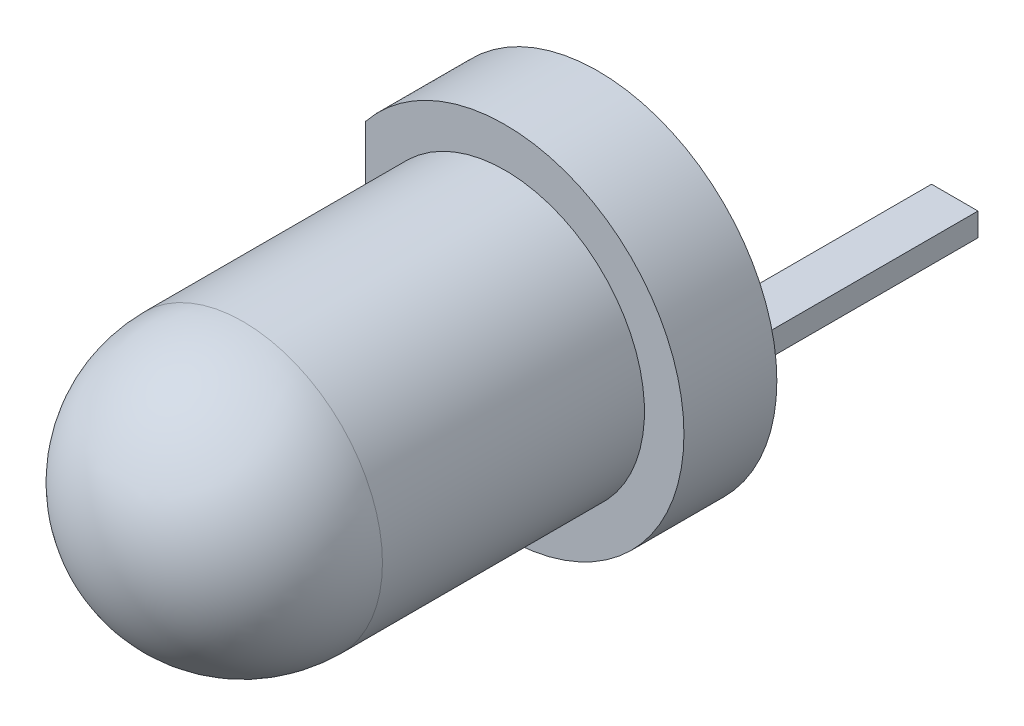
ISO-10303-21;
HEADER;
FILE_DESCRIPTION(('STEP AP214'),'2;1');
FILE_NAME('part.step','',(''),(''),'','','');
FILE_SCHEMA(('AUTOMOTIVE_DESIGN { 1 0 10303 214 1 1 1 1 }'));
ENDSEC;
DATA;
#1=APPLICATION_CONTEXT('core data for automotive mechanical design processes');
#2=APPLICATION_PROTOCOL_DEFINITION('international standard','automotive_design',2000,#1);
#3=PRODUCT_CONTEXT('',#1,'mechanical');
#4=PRODUCT('Part','Part','',(#3));
#5=PRODUCT_RELATED_PRODUCT_CATEGORY('part','',(#4));
#6=PRODUCT_DEFINITION_FORMATION('','',#4);
#7=PRODUCT_DEFINITION_CONTEXT('part definition',#1,'design');
#8=PRODUCT_DEFINITION('design','',#6,#7);
#9=PRODUCT_DEFINITION_SHAPE('','',#8);
#10=(LENGTH_UNIT() NAMED_UNIT(*) SI_UNIT(.MILLI.,.METRE.));
#11=(NAMED_UNIT(*) PLANE_ANGLE_UNIT() SI_UNIT($,.RADIAN.));
#12=(NAMED_UNIT(*) SI_UNIT($,.STERADIAN.) SOLID_ANGLE_UNIT());
#13=UNCERTAINTY_MEASURE_WITH_UNIT(LENGTH_MEASURE(1.E-05),#10,'distance_accuracy_value','');
#14=(GEOMETRIC_REPRESENTATION_CONTEXT(3) GLOBAL_UNCERTAINTY_ASSIGNED_CONTEXT((#13)) GLOBAL_UNIT_ASSIGNED_CONTEXT((#10,
#11,#12)) REPRESENTATION_CONTEXT('',''));
#15=CARTESIAN_POINT('',(0.,0.,0.));
#16=DIRECTION('',(0.,0.,1.));
#17=DIRECTION('',(1.,0.,0.));
#18=AXIS2_PLACEMENT_3D('',#15,#16,#17);
#19=CARTESIAN_POINT('',(-0.99,-0.125,-2.54));
#20=DIRECTION('',(-1.,0.,0.));
#21=DIRECTION('',(0.,0.,1.));
#22=AXIS2_PLACEMENT_3D('',#19,#20,#21);
#23=PLANE('',#22);
#24=DIRECTION('',(0.,-1.,0.));
#25=VECTOR('',#24,1.);
#26=CARTESIAN_POINT('',(-0.99,-0.125,-1.54));
#27=LINE('',#26,#25);
#28=CARTESIAN_POINT('',(-0.99,0.125,-1.54));
#29=VERTEX_POINT('',#28);
#30=CARTESIAN_POINT('',(-0.99,-0.125,-1.54));
#31=VERTEX_POINT('',#30);
#32=EDGE_CURVE('E121',#29,#31,#27,.T.);
#33=ORIENTED_EDGE('',*,*,#32,.F.);
#34=DIRECTION('',(0.,0.,1.));
#35=VECTOR('',#34,1.);
#36=CARTESIAN_POINT('',(-0.99,0.125,-2.54));
#37=LINE('',#36,#35);
#38=CARTESIAN_POINT('',(-0.99,0.125,0.));
#39=VERTEX_POINT('',#38);
#40=EDGE_CURVE('E129',#29,#39,#37,.T.);
#41=ORIENTED_EDGE('',*,*,#40,.T.);
#42=DIRECTION('',(0.,-1.,0.));
#43=VECTOR('',#42,1.);
#44=CARTESIAN_POINT('',(-0.99,-0.125,0.));
#45=LINE('',#44,#43);
#46=CARTESIAN_POINT('',(-0.99,-0.125,0.));
#47=VERTEX_POINT('',#46);
#48=EDGE_CURVE('E151',#39,#47,#45,.T.);
#49=ORIENTED_EDGE('',*,*,#48,.T.);
#50=DIRECTION('',(0.,0.,1.));
#51=VECTOR('',#50,1.);
#52=CARTESIAN_POINT('',(-0.99,-0.125,-2.54));
#53=LINE('',#52,#51);
#54=EDGE_CURVE('E131',#31,#47,#53,.T.);
#55=ORIENTED_EDGE('',*,*,#54,.F.);
#56=EDGE_LOOP('',(#33,#41,#49,#55));
#57=FACE_BOUND('',#56,.T.);
#58=ADVANCED_FACE('F43',(#57),#23,.F.);
#59=CARTESIAN_POINT('',(-1.49,-0.125,-2.54));
#60=DIRECTION('',(0.,1.,0.));
#61=DIRECTION('',(-1.,0.,0.));
#62=AXIS2_PLACEMENT_3D('',#59,#60,#61);
#63=PLANE('',#62);
#64=DIRECTION('',(-1.,0.,0.));
#65=VECTOR('',#64,1.);
#66=CARTESIAN_POINT('',(-1.49,-0.125,-1.54));
#67=LINE('',#66,#65);
#68=CARTESIAN_POINT('',(-1.49,-0.125,-1.54));
#69=VERTEX_POINT('',#68);
#70=EDGE_CURVE('E132',#31,#69,#67,.T.);
#71=ORIENTED_EDGE('',*,*,#70,.F.);
#72=ORIENTED_EDGE('',*,*,#54,.T.);
#73=DIRECTION('',(-1.,0.,0.));
#74=VECTOR('',#73,1.);
#75=CARTESIAN_POINT('',(-1.49,-0.125,0.));
#76=LINE('',#75,#74);
#77=CARTESIAN_POINT('',(-1.49,-0.125,0.));
#78=VERTEX_POINT('',#77);
#79=EDGE_CURVE('E148',#47,#78,#76,.T.);
#80=ORIENTED_EDGE('',*,*,#79,.T.);
#81=DIRECTION('',(0.,0.,1.));
#82=VECTOR('',#81,1.);
#83=CARTESIAN_POINT('',(-1.49,-0.125,-2.54));
#84=LINE('',#83,#82);
#85=EDGE_CURVE('E142',#69,#78,#84,.T.);
#86=ORIENTED_EDGE('',*,*,#85,.F.);
#87=EDGE_LOOP('',(#71,#72,#80,#86));
#88=FACE_BOUND('',#87,.T.);
#89=ADVANCED_FACE('F194',(#88),#63,.F.);
#90=CARTESIAN_POINT('',(-1.49,-0.125,-2.54));
#91=DIRECTION('',(1.,0.,0.));
#92=DIRECTION('',(0.,0.,-1.));
#93=AXIS2_PLACEMENT_3D('',#90,#91,#92);
#94=PLANE('',#93);
#95=DIRECTION('',(0.,1.,0.));
#96=VECTOR('',#95,1.);
#97=CARTESIAN_POINT('',(-1.49,-0.125,-1.54));
#98=LINE('',#97,#96);
#99=CARTESIAN_POINT('',(-1.49,0.125,-1.54));
#100=VERTEX_POINT('',#99);
#101=EDGE_CURVE('E57',#69,#100,#98,.T.);
#102=ORIENTED_EDGE('',*,*,#101,.F.);
#103=ORIENTED_EDGE('',*,*,#85,.T.);
#104=DIRECTION('',(0.,1.,0.));
#105=VECTOR('',#104,1.);
#106=CARTESIAN_POINT('',(-1.49,-0.125,0.));
#107=LINE('',#106,#105);
#108=CARTESIAN_POINT('',(-1.49,0.125,0.));
#109=VERTEX_POINT('',#108);
#110=EDGE_CURVE('E140',#78,#109,#107,.T.);
#111=ORIENTED_EDGE('',*,*,#110,.T.);
#112=DIRECTION('',(0.,0.,1.));
#113=VECTOR('',#112,1.);
#114=CARTESIAN_POINT('',(-1.49,0.125,-2.54));
#115=LINE('',#114,#113);
#116=EDGE_CURVE('E138',#100,#109,#115,.T.);
#117=ORIENTED_EDGE('',*,*,#116,.F.);
#118=EDGE_LOOP('',(#102,#103,#111,#117));
#119=FACE_BOUND('',#118,.T.);
#120=ADVANCED_FACE('F199',(#119),#94,.F.);
#121=CARTESIAN_POINT('',(-1.49,0.125,-2.54));
#122=DIRECTION('',(0.,-1.,0.));
#123=DIRECTION('',(1.,0.,0.));
#124=AXIS2_PLACEMENT_3D('',#121,#122,#123);
#125=PLANE('',#124);
#126=DIRECTION('',(1.,0.,0.));
#127=VECTOR('',#126,1.);
#128=CARTESIAN_POINT('',(-1.49,0.125,-1.54));
#129=LINE('',#128,#127);
#130=EDGE_CURVE('E11',#100,#29,#129,.T.);
#131=ORIENTED_EDGE('',*,*,#130,.F.);
#132=ORIENTED_EDGE('',*,*,#116,.T.);
#133=DIRECTION('',(1.,0.,0.));
#134=VECTOR('',#133,1.);
#135=CARTESIAN_POINT('',(-1.49,0.125,0.));
#136=LINE('',#135,#134);
#137=EDGE_CURVE('E137',#109,#39,#136,.T.);
#138=ORIENTED_EDGE('',*,*,#137,.T.);
#139=ORIENTED_EDGE('',*,*,#40,.F.);
#140=EDGE_LOOP('',(#131,#132,#138,#139));
#141=FACE_BOUND('',#140,.T.);
#142=ADVANCED_FACE('F135',(#141),#125,.F.);
#143=CARTESIAN_POINT('',(0.,0.,0.));
#144=DIRECTION('',(0.,0.,1.));
#145=DIRECTION('',(1.,0.,0.));
#146=AXIS2_PLACEMENT_3D('',#143,#144,#145);
#147=PLANE('',#146);
#148=ORIENTED_EDGE('',*,*,#48,.F.);
#149=ORIENTED_EDGE('',*,*,#137,.F.);
#150=ORIENTED_EDGE('',*,*,#110,.F.);
#151=ORIENTED_EDGE('',*,*,#79,.F.);
#152=EDGE_LOOP('',(#148,#149,#150,#151));
#153=FACE_BOUND('',#152,.T.);
#154=DIRECTION('',(0.,1.,0.));
#155=VECTOR('',#154,1.);
#156=CARTESIAN_POINT('',(-1.5,-1.20649285120137,0.));
#157=LINE('',#156,#155);
#158=CARTESIAN_POINT('',(-1.5,-1.20649285120137,0.));
#159=VERTEX_POINT('',#158);
#160=CARTESIAN_POINT('',(-1.5,1.20649285120137,0.));
#161=VERTEX_POINT('',#160);
#162=EDGE_CURVE('E158',#159,#161,#157,.T.);
#163=ORIENTED_EDGE('',*,*,#162,.T.);
#164=CARTESIAN_POINT('',(0.,0.,0.));
#165=DIRECTION('',(0.,0.,-1.));
#166=DIRECTION('',(-1.,0.,0.));
#167=AXIS2_PLACEMENT_3D('',#164,#165,#166);
#168=CIRCLE('',#167,1.925);
#169=EDGE_CURVE('E163',#161,#159,#168,.T.);
#170=ORIENTED_EDGE('',*,*,#169,.T.);
#171=EDGE_LOOP('',(#163,#170));
#172=FACE_BOUND('',#171,.T.);
#173=DIRECTION('',(0.,1.,0.));
#174=VECTOR('',#173,1.);
#175=CARTESIAN_POINT('',(1.05,0.125,0.));
#176=LINE('',#175,#174);
#177=CARTESIAN_POINT('',(1.05,-0.125,0.));
#178=VERTEX_POINT('',#177);
#179=CARTESIAN_POINT('',(1.05,0.125,0.));
#180=VERTEX_POINT('',#179);
#181=EDGE_CURVE('E153',#178,#180,#176,.T.);
#182=ORIENTED_EDGE('',*,*,#181,.F.);
#183=DIRECTION('',(-1.,0.,0.));
#184=VECTOR('',#183,1.);
#185=CARTESIAN_POINT('',(1.55,-0.125,0.));
#186=LINE('',#185,#184);
#187=CARTESIAN_POINT('',(1.55,-0.125,0.));
#188=VERTEX_POINT('',#187);
#189=EDGE_CURVE('E227',#188,#178,#186,.T.);
#190=ORIENTED_EDGE('',*,*,#189,.F.);
#191=DIRECTION('',(0.,-1.,0.));
#192=VECTOR('',#191,1.);
#193=CARTESIAN_POINT('',(1.55,0.125,0.));
#194=LINE('',#193,#192);
#195=CARTESIAN_POINT('',(1.55,0.125,0.));
#196=VERTEX_POINT('',#195);
#197=EDGE_CURVE('E243',#196,#188,#194,.T.);
#198=ORIENTED_EDGE('',*,*,#197,.F.);
#199=DIRECTION('',(1.,0.,0.));
#200=VECTOR('',#199,1.);
#201=CARTESIAN_POINT('',(1.55,0.125,0.));
#202=LINE('',#201,#200);
#203=EDGE_CURVE('E65',#180,#196,#202,.T.);
#204=ORIENTED_EDGE('',*,*,#203,.F.);
#205=EDGE_LOOP('',(#182,#190,#198,#204));
#206=FACE_BOUND('',#205,.T.);
#207=ADVANCED_FACE('F183',(#153,#172,#206),#147,.F.);
#208=CARTESIAN_POINT('',(0.,0.,5.32));
#209=DIRECTION('',(0.,0.,-1.));
#210=DIRECTION('',(-1.,0.,0.));
#211=AXIS2_PLACEMENT_3D('',#208,#209,#210);
#212=CYLINDRICAL_SURFACE('',#211,1.5);
#213=CARTESIAN_POINT('',(0.,0.,3.82));
#214=DIRECTION('',(0.,0.,-1.));
#215=DIRECTION('',(-1.,0.,0.));
#216=AXIS2_PLACEMENT_3D('',#213,#214,#215);
#217=CIRCLE('',#216,1.5);
#218=CARTESIAN_POINT('',(-1.5,0.,3.82));
#219=VERTEX_POINT('',#218);
#220=EDGE_CURVE('E171',#219,#219,#217,.T.);
#221=ORIENTED_EDGE('',*,*,#220,.T.);
#222=EDGE_LOOP('',(#221));
#223=FACE_BOUND('',#222,.T.);
#224=CARTESIAN_POINT('',(0.,0.,1.));
#225=DIRECTION('',(0.,0.,-1.));
#226=DIRECTION('',(-1.,0.,0.));
#227=AXIS2_PLACEMENT_3D('',#224,#225,#226);
#228=CIRCLE('',#227,1.5);
#229=CARTESIAN_POINT('',(-1.5,0.,1.));
#230=VERTEX_POINT('',#229);
#231=EDGE_CURVE('E51',#230,#230,#228,.T.);
#232=ORIENTED_EDGE('',*,*,#231,.F.);
#233=EDGE_LOOP('',(#232));
#234=FACE_BOUND('',#233,.T.);
#235=ADVANCED_FACE('F181',(#223,#234),#212,.T.);
#236=CARTESIAN_POINT('',(0.,0.,3.82));
#237=DIRECTION('',(0.,0.,1.));
#238=DIRECTION('',(1.,0.,0.));
#239=AXIS2_PLACEMENT_3D('',#236,#237,#238);
#240=SPHERICAL_SURFACE('',#239,1.5);
#241=ORIENTED_EDGE('',*,*,#220,.F.);
#242=EDGE_LOOP('',(#241));
#243=FACE_BOUND('',#242,.T.);
#244=ADVANCED_FACE('F45',(#243),#240,.T.);
#245=CARTESIAN_POINT('',(-1.5,-1.20649285120137,1.));
#246=DIRECTION('',(-1.,0.,0.));
#247=DIRECTION('',(0.,0.,1.));
#248=AXIS2_PLACEMENT_3D('',#245,#246,#247);
#249=PLANE('',#248);
#250=DIRECTION('',(0.,0.,-1.));
#251=VECTOR('',#250,1.);
#252=CARTESIAN_POINT('',(-1.5,1.20649285120137,1.));
#253=LINE('',#252,#251);
#254=CARTESIAN_POINT('',(-1.5,1.20649285120137,1.));
#255=VERTEX_POINT('',#254);
#256=EDGE_CURVE('E168',#255,#161,#253,.T.);
#257=ORIENTED_EDGE('',*,*,#256,.T.);
#258=ORIENTED_EDGE('',*,*,#162,.F.);
#259=DIRECTION('',(0.,0.,-1.));
#260=VECTOR('',#259,1.);
#261=CARTESIAN_POINT('',(-1.5,-1.20649285120137,1.));
#262=LINE('',#261,#260);
#263=CARTESIAN_POINT('',(-1.5,-1.20649285120137,1.));
#264=VERTEX_POINT('',#263);
#265=EDGE_CURVE('E162',#264,#159,#262,.T.);
#266=ORIENTED_EDGE('',*,*,#265,.F.);
#267=DIRECTION('',(0.,1.,0.));
#268=VECTOR('',#267,1.);
#269=CARTESIAN_POINT('',(-1.5,-1.20649285120137,1.));
#270=LINE('',#269,#268);
#271=EDGE_CURVE('E159',#264,#230,#270,.T.);
#272=ORIENTED_EDGE('',*,*,#271,.T.);
#273=EDGE_CURVE('E157',#230,#255,#270,.T.);
#274=ORIENTED_EDGE('',*,*,#273,.T.);
#275=EDGE_LOOP('',(#257,#258,#266,#272,#274));
#276=FACE_BOUND('',#275,.T.);
#277=ADVANCED_FACE('F189',(#276),#249,.T.);
#278=CARTESIAN_POINT('',(0.,0.,1.));
#279=DIRECTION('',(0.,0.,-1.));
#280=DIRECTION('',(-1.,0.,0.));
#281=AXIS2_PLACEMENT_3D('',#278,#279,#280);
#282=CYLINDRICAL_SURFACE('',#281,1.925);
#283=ORIENTED_EDGE('',*,*,#169,.F.);
#284=ORIENTED_EDGE('',*,*,#256,.F.);
#285=CARTESIAN_POINT('',(0.,0.,1.));
#286=DIRECTION('',(0.,0.,-1.));
#287=DIRECTION('',(-1.,0.,0.));
#288=AXIS2_PLACEMENT_3D('',#285,#286,#287);
#289=CIRCLE('',#288,1.925);
#290=EDGE_CURVE('E154',#255,#264,#289,.T.);
#291=ORIENTED_EDGE('',*,*,#290,.T.);
#292=ORIENTED_EDGE('',*,*,#265,.T.);
#293=EDGE_LOOP('',(#283,#284,#291,#292));
#294=FACE_BOUND('',#293,.T.);
#295=ADVANCED_FACE('F213',(#294),#282,.T.);
#296=CARTESIAN_POINT('',(0.,0.,1.));
#297=DIRECTION('',(0.,0.,-1.));
#298=DIRECTION('',(-1.,0.,0.));
#299=AXIS2_PLACEMENT_3D('',#296,#297,#298);
#300=PLANE('',#299);
#301=ORIENTED_EDGE('',*,*,#273,.F.);
#302=ORIENTED_EDGE('',*,*,#231,.T.);
#303=ORIENTED_EDGE('',*,*,#271,.F.);
#304=ORIENTED_EDGE('',*,*,#290,.F.);
#305=EDGE_LOOP('',(#301,#302,#303,#304));
#306=FACE_BOUND('',#305,.T.);
#307=ADVANCED_FACE('F178',(#306),#300,.F.);
#308=CARTESIAN_POINT('',(1.05,0.125,-2.54));
#309=DIRECTION('',(1.,0.,0.));
#310=DIRECTION('',(0.,1.,0.));
#311=AXIS2_PLACEMENT_3D('',#308,#309,#310);
#312=PLANE('',#311);
#313=ORIENTED_EDGE('',*,*,#181,.T.);
#314=DIRECTION('',(0.,0.,1.));
#315=VECTOR('',#314,1.);
#316=CARTESIAN_POINT('',(1.05,0.125,-2.54));
#317=LINE('',#316,#315);
#318=CARTESIAN_POINT('',(1.05,0.125,-2.54));
#319=VERTEX_POINT('',#318);
#320=EDGE_CURVE('E166',#319,#180,#317,.T.);
#321=ORIENTED_EDGE('',*,*,#320,.F.);
#322=DIRECTION('',(0.,1.,0.));
#323=VECTOR('',#322,1.);
#324=CARTESIAN_POINT('',(1.05,0.125,-2.54));
#325=LINE('',#324,#323);
#326=CARTESIAN_POINT('',(1.05,-0.125,-2.54));
#327=VERTEX_POINT('',#326);
#328=EDGE_CURVE('E242',#327,#319,#325,.T.);
#329=ORIENTED_EDGE('',*,*,#328,.F.);
#330=DIRECTION('',(0.,0.,1.));
#331=VECTOR('',#330,1.);
#332=CARTESIAN_POINT('',(1.05,-0.125,-2.54));
#333=LINE('',#332,#331);
#334=EDGE_CURVE('E238',#327,#178,#333,.T.);
#335=ORIENTED_EDGE('',*,*,#334,.T.);
#336=EDGE_LOOP('',(#313,#321,#329,#335));
#337=FACE_BOUND('',#336,.T.);
#338=ADVANCED_FACE('F203',(#337),#312,.F.);
#339=CARTESIAN_POINT('',(1.55,0.125,-2.54));
#340=DIRECTION('',(0.,-1.,0.));
#341=DIRECTION('',(1.,0.,0.));
#342=AXIS2_PLACEMENT_3D('',#339,#340,#341);
#343=PLANE('',#342);
#344=ORIENTED_EDGE('',*,*,#203,.T.);
#345=DIRECTION('',(0.,0.,1.));
#346=VECTOR('',#345,1.);
#347=CARTESIAN_POINT('',(1.55,0.125,-2.54));
#348=LINE('',#347,#346);
#349=CARTESIAN_POINT('',(1.55,0.125,-2.54));
#350=VERTEX_POINT('',#349);
#351=EDGE_CURVE('E248',#350,#196,#348,.T.);
#352=ORIENTED_EDGE('',*,*,#351,.F.);
#353=DIRECTION('',(1.,0.,0.));
#354=VECTOR('',#353,1.);
#355=CARTESIAN_POINT('',(1.55,0.125,-2.54));
#356=LINE('',#355,#354);
#357=EDGE_CURVE('E264',#319,#350,#356,.T.);
#358=ORIENTED_EDGE('',*,*,#357,.F.);
#359=ORIENTED_EDGE('',*,*,#320,.T.);
#360=EDGE_LOOP('',(#344,#352,#358,#359));
#361=FACE_BOUND('',#360,.T.);
#362=ADVANCED_FACE('F272',(#361),#343,.F.);
#363=CARTESIAN_POINT('',(1.55,0.125,-2.54));
#364=DIRECTION('',(-1.,0.,0.));
#365=DIRECTION('',(0.,0.,1.));
#366=AXIS2_PLACEMENT_3D('',#363,#364,#365);
#367=PLANE('',#366);
#368=ORIENTED_EDGE('',*,*,#197,.T.);
#369=DIRECTION('',(0.,0.,1.));
#370=VECTOR('',#369,1.);
#371=CARTESIAN_POINT('',(1.55,-0.125,-2.54));
#372=LINE('',#371,#370);
#373=CARTESIAN_POINT('',(1.55,-0.125,-2.54));
#374=VERTEX_POINT('',#373);
#375=EDGE_CURVE('E241',#374,#188,#372,.T.);
#376=ORIENTED_EDGE('',*,*,#375,.F.);
#377=DIRECTION('',(0.,-1.,0.));
#378=VECTOR('',#377,1.);
#379=CARTESIAN_POINT('',(1.55,0.125,-2.54));
#380=LINE('',#379,#378);
#381=EDGE_CURVE('E250',#350,#374,#380,.T.);
#382=ORIENTED_EDGE('',*,*,#381,.F.);
#383=ORIENTED_EDGE('',*,*,#351,.T.);
#384=EDGE_LOOP('',(#368,#376,#382,#383));
#385=FACE_BOUND('',#384,.T.);
#386=ADVANCED_FACE('F268',(#385),#367,.F.);
#387=CARTESIAN_POINT('',(1.55,-0.125,-2.54));
#388=DIRECTION('',(0.,1.,0.));
#389=DIRECTION('',(0.,0.,1.));
#390=AXIS2_PLACEMENT_3D('',#387,#388,#389);
#391=PLANE('',#390);
#392=ORIENTED_EDGE('',*,*,#189,.T.);
#393=ORIENTED_EDGE('',*,*,#334,.F.);
#394=DIRECTION('',(-1.,0.,0.));
#395=VECTOR('',#394,1.);
#396=CARTESIAN_POINT('',(1.55,-0.125,-2.54));
#397=LINE('',#396,#395);
#398=EDGE_CURVE('E246',#374,#327,#397,.T.);
#399=ORIENTED_EDGE('',*,*,#398,.F.);
#400=ORIENTED_EDGE('',*,*,#375,.T.);
#401=EDGE_LOOP('',(#392,#393,#399,#400));
#402=FACE_BOUND('',#401,.T.);
#403=ADVANCED_FACE('F236',(#402),#391,.F.);
#404=CARTESIAN_POINT('',(0.,0.,-2.54));
#405=DIRECTION('',(0.,0.,-1.));
#406=DIRECTION('',(-1.,0.,0.));
#407=AXIS2_PLACEMENT_3D('',#404,#405,#406);
#408=PLANE('',#407);
#409=ORIENTED_EDGE('',*,*,#328,.T.);
#410=ORIENTED_EDGE('',*,*,#357,.T.);
#411=ORIENTED_EDGE('',*,*,#381,.T.);
#412=ORIENTED_EDGE('',*,*,#398,.T.);
#413=EDGE_LOOP('',(#409,#410,#411,#412));
#414=FACE_BOUND('',#413,.T.);
#415=ADVANCED_FACE('F274',(#414),#408,.T.);
#416=CARTESIAN_POINT('',(0.,0.,-1.54));
#417=DIRECTION('',(0.,0.,-1.));
#418=DIRECTION('',(-1.,0.,0.));
#419=AXIS2_PLACEMENT_3D('',#416,#417,#418);
#420=PLANE('',#419);
#421=ORIENTED_EDGE('',*,*,#32,.T.);
#422=ORIENTED_EDGE('',*,*,#70,.T.);
#423=ORIENTED_EDGE('',*,*,#101,.T.);
#424=ORIENTED_EDGE('',*,*,#130,.T.);
#425=EDGE_LOOP('',(#421,#422,#423,#424));
#426=FACE_BOUND('',#425,.T.);
#427=ADVANCED_FACE('F120',(#426),#420,.T.);
#428=CLOSED_SHELL('',(#58,#89,#120,#142,#207,#235,#244,#277,#295,#307,#338,#362,#386,#403,#415,#427));
#429=MANIFOLD_SOLID_BREP('B2',#428);
#430=ADVANCED_BREP_SHAPE_REPRESENTATION('',(#18,#429),#14);
#431=SHAPE_DEFINITION_REPRESENTATION(#9,#430);
ENDSEC;
END-ISO-10303-21;
